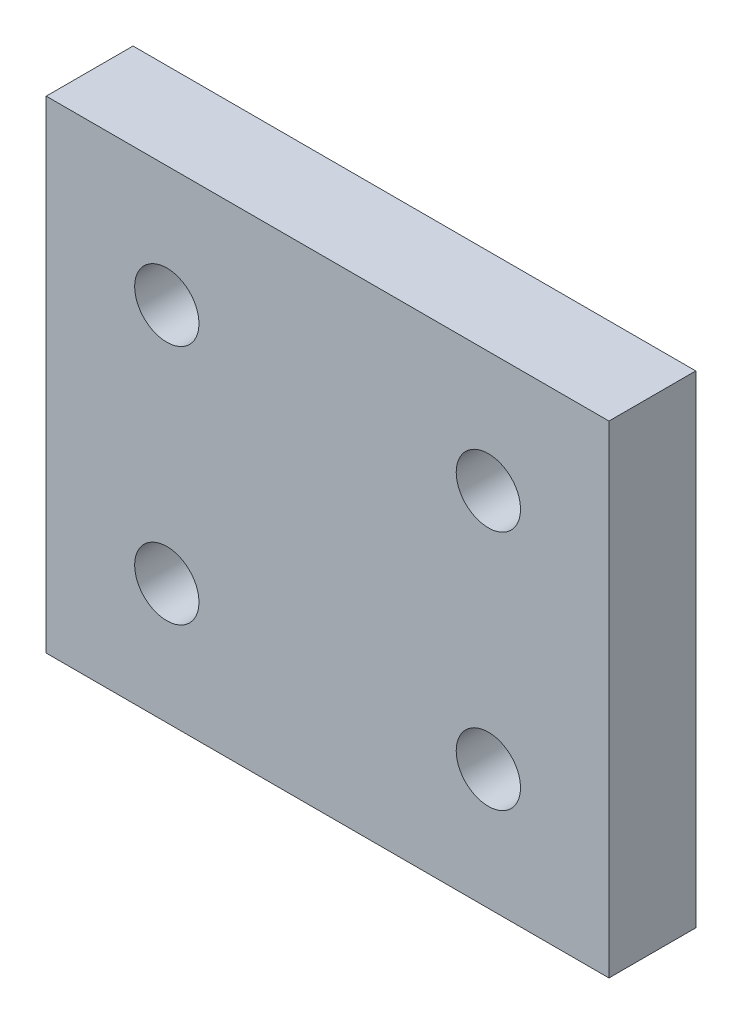
ISO-10303-21;
HEADER;
FILE_DESCRIPTION(('STEP AP214'),'2;1');
FILE_NAME('part.step','',(''),(''),'','','');
FILE_SCHEMA(('AUTOMOTIVE_DESIGN { 1 0 10303 214 1 1 1 1 }'));
ENDSEC;
DATA;
#1=APPLICATION_CONTEXT('core data for automotive mechanical design processes');
#2=APPLICATION_PROTOCOL_DEFINITION('international standard','automotive_design',2000,#1);
#3=PRODUCT_CONTEXT('',#1,'mechanical');
#4=PRODUCT('Part','Part','',(#3));
#5=PRODUCT_RELATED_PRODUCT_CATEGORY('part','',(#4));
#6=PRODUCT_DEFINITION_FORMATION('','',#4);
#7=PRODUCT_DEFINITION_CONTEXT('part definition',#1,'design');
#8=PRODUCT_DEFINITION('design','',#6,#7);
#9=PRODUCT_DEFINITION_SHAPE('','',#8);
#10=(LENGTH_UNIT() NAMED_UNIT(*) SI_UNIT(.MILLI.,.METRE.));
#11=(NAMED_UNIT(*) PLANE_ANGLE_UNIT() SI_UNIT($,.RADIAN.));
#12=(NAMED_UNIT(*) SI_UNIT($,.STERADIAN.) SOLID_ANGLE_UNIT());
#13=UNCERTAINTY_MEASURE_WITH_UNIT(LENGTH_MEASURE(1.E-05),#10,'distance_accuracy_value','');
#14=(GEOMETRIC_REPRESENTATION_CONTEXT(3) GLOBAL_UNCERTAINTY_ASSIGNED_CONTEXT((#13)) GLOBAL_UNIT_ASSIGNED_CONTEXT((#10,
#11,#12)) REPRESENTATION_CONTEXT('',''));
#15=CARTESIAN_POINT('',(0.,0.,0.));
#16=DIRECTION('',(0.,0.,1.));
#17=DIRECTION('',(1.,0.,0.));
#18=AXIS2_PLACEMENT_3D('',#15,#16,#17);
#19=CARTESIAN_POINT('',(0.,0.,5.4));
#20=DIRECTION('',(0.,0.,1.));
#21=DIRECTION('',(1.,0.,0.));
#22=AXIS2_PLACEMENT_3D('',#19,#20,#21);
#23=PLANE('',#22);
#24=CARTESIAN_POINT('',(-10.,19.84,5.4));
#25=DIRECTION('',(0.,0.,1.));
#26=DIRECTION('',(1.,0.,0.));
#27=AXIS2_PLACEMENT_3D('',#24,#25,#26);
#28=CIRCLE('',#27,2.);
#29=CARTESIAN_POINT('',(-12.,19.84,5.4));
#30=VERTEX_POINT('',#29);
#31=EDGE_CURVE('E104',#30,#30,#28,.F.);
#32=ORIENTED_EDGE('',*,*,#31,.T.);
#33=EDGE_LOOP('',(#32));
#34=FACE_BOUND('',#33,.T.);
#35=DIRECTION('',(-1.,0.,0.));
#36=VECTOR('',#35,1.);
#37=CARTESIAN_POINT('',(0.,-2.655,5.4));
#38=LINE('',#37,#36);
#39=CARTESIAN_POINT('',(17.5,-2.655,5.4));
#40=VERTEX_POINT('',#39);
#41=CARTESIAN_POINT('',(-17.5,-2.655,5.4));
#42=VERTEX_POINT('',#41);
#43=EDGE_CURVE('E109',#40,#42,#38,.T.);
#44=ORIENTED_EDGE('',*,*,#43,.F.);
#45=DIRECTION('',(0.,1.,0.));
#46=VECTOR('',#45,1.);
#47=CARTESIAN_POINT('',(17.5,-30.,5.4));
#48=LINE('',#47,#46);
#49=CARTESIAN_POINT('',(17.5,27.345,5.4));
#50=VERTEX_POINT('',#49);
#51=EDGE_CURVE('E11',#40,#50,#48,.T.);
#52=ORIENTED_EDGE('',*,*,#51,.T.);
#53=DIRECTION('',(1.,0.,0.));
#54=VECTOR('',#53,1.);
#55=CARTESIAN_POINT('',(0.,27.345,5.4));
#56=LINE('',#55,#54);
#57=CARTESIAN_POINT('',(-17.5,27.345,5.4));
#58=VERTEX_POINT('',#57);
#59=EDGE_CURVE('E117',#58,#50,#56,.T.);
#60=ORIENTED_EDGE('',*,*,#59,.F.);
#61=DIRECTION('',(0.,-1.,0.));
#62=VECTOR('',#61,1.);
#63=CARTESIAN_POINT('',(-17.5,-30.,5.4));
#64=LINE('',#63,#62);
#65=EDGE_CURVE('E46',#58,#42,#64,.T.);
#66=ORIENTED_EDGE('',*,*,#65,.T.);
#67=EDGE_LOOP('',(#44,#52,#60,#66));
#68=FACE_BOUND('',#67,.T.);
#69=CARTESIAN_POINT('',(10.,4.84,5.4));
#70=DIRECTION('',(0.,0.,1.));
#71=DIRECTION('',(1.,0.,0.));
#72=AXIS2_PLACEMENT_3D('',#69,#70,#71);
#73=CIRCLE('',#72,2.);
#74=CARTESIAN_POINT('',(8.,4.84,5.4));
#75=VERTEX_POINT('',#74);
#76=EDGE_CURVE('E114',#75,#75,#73,.F.);
#77=ORIENTED_EDGE('',*,*,#76,.T.);
#78=EDGE_LOOP('',(#77));
#79=FACE_BOUND('',#78,.T.);
#80=CARTESIAN_POINT('',(-10.,4.84,5.4));
#81=DIRECTION('',(0.,0.,1.));
#82=DIRECTION('',(1.,0.,0.));
#83=AXIS2_PLACEMENT_3D('',#80,#81,#82);
#84=CIRCLE('',#83,2.);
#85=CARTESIAN_POINT('',(-12.,4.84,5.4));
#86=VERTEX_POINT('',#85);
#87=EDGE_CURVE('E111',#86,#86,#84,.F.);
#88=ORIENTED_EDGE('',*,*,#87,.T.);
#89=EDGE_LOOP('',(#88));
#90=FACE_BOUND('',#89,.T.);
#91=CARTESIAN_POINT('',(10.,19.84,5.4));
#92=DIRECTION('',(0.,0.,1.));
#93=DIRECTION('',(1.,0.,0.));
#94=AXIS2_PLACEMENT_3D('',#91,#92,#93);
#95=CIRCLE('',#94,2.);
#96=CARTESIAN_POINT('',(8.,19.84,5.4));
#97=VERTEX_POINT('',#96);
#98=EDGE_CURVE('E100',#97,#97,#95,.F.);
#99=ORIENTED_EDGE('',*,*,#98,.T.);
#100=EDGE_LOOP('',(#99));
#101=FACE_BOUND('',#100,.T.);
#102=ADVANCED_FACE('F37',(#34,#68,#79,#90,#101),#23,.T.);
#103=CARTESIAN_POINT('',(0.,0.,0.));
#104=DIRECTION('',(0.,0.,1.));
#105=DIRECTION('',(1.,0.,0.));
#106=AXIS2_PLACEMENT_3D('',#103,#104,#105);
#107=PLANE('',#106);
#108=DIRECTION('',(0.,1.,0.));
#109=VECTOR('',#108,1.);
#110=CARTESIAN_POINT('',(17.5,-30.,0.));
#111=LINE('',#110,#109);
#112=CARTESIAN_POINT('',(17.5,-2.655,0.));
#113=VERTEX_POINT('',#112);
#114=CARTESIAN_POINT('',(17.5,27.345,0.));
#115=VERTEX_POINT('',#114);
#116=EDGE_CURVE('E41',#113,#115,#111,.T.);
#117=ORIENTED_EDGE('',*,*,#116,.F.);
#118=DIRECTION('',(-1.,0.,0.));
#119=VECTOR('',#118,1.);
#120=CARTESIAN_POINT('',(0.,-2.655,0.));
#121=LINE('',#120,#119);
#122=CARTESIAN_POINT('',(-17.5,-2.655,0.));
#123=VERTEX_POINT('',#122);
#124=EDGE_CURVE('E77',#113,#123,#121,.T.);
#125=ORIENTED_EDGE('',*,*,#124,.T.);
#126=DIRECTION('',(0.,-1.,0.));
#127=VECTOR('',#126,1.);
#128=CARTESIAN_POINT('',(-17.5,-30.,0.));
#129=LINE('',#128,#127);
#130=CARTESIAN_POINT('',(-17.5,27.345,0.));
#131=VERTEX_POINT('',#130);
#132=EDGE_CURVE('E97',#131,#123,#129,.T.);
#133=ORIENTED_EDGE('',*,*,#132,.F.);
#134=DIRECTION('',(-1.,0.,0.));
#135=VECTOR('',#134,1.);
#136=CARTESIAN_POINT('',(0.,27.345,0.));
#137=LINE('',#136,#135);
#138=EDGE_CURVE('E96',#115,#131,#137,.T.);
#139=ORIENTED_EDGE('',*,*,#138,.F.);
#140=EDGE_LOOP('',(#117,#125,#133,#139));
#141=FACE_BOUND('',#140,.T.);
#142=CARTESIAN_POINT('',(10.,4.84,0.));
#143=DIRECTION('',(0.,0.,1.));
#144=DIRECTION('',(1.,0.,0.));
#145=AXIS2_PLACEMENT_3D('',#142,#143,#144);
#146=CIRCLE('',#145,2.);
#147=CARTESIAN_POINT('',(8.,4.84,0.));
#148=VERTEX_POINT('',#147);
#149=EDGE_CURVE('E86',#148,#148,#146,.F.);
#150=ORIENTED_EDGE('',*,*,#149,.F.);
#151=EDGE_LOOP('',(#150));
#152=FACE_BOUND('',#151,.T.);
#153=CARTESIAN_POINT('',(-10.,4.84,0.));
#154=DIRECTION('',(0.,0.,1.));
#155=DIRECTION('',(1.,0.,0.));
#156=AXIS2_PLACEMENT_3D('',#153,#154,#155);
#157=CIRCLE('',#156,2.);
#158=CARTESIAN_POINT('',(-12.,4.84,0.));
#159=VERTEX_POINT('',#158);
#160=EDGE_CURVE('E127',#159,#159,#157,.F.);
#161=ORIENTED_EDGE('',*,*,#160,.F.);
#162=EDGE_LOOP('',(#161));
#163=FACE_BOUND('',#162,.T.);
#164=CARTESIAN_POINT('',(-10.,19.84,0.));
#165=DIRECTION('',(0.,0.,1.));
#166=DIRECTION('',(1.,0.,0.));
#167=AXIS2_PLACEMENT_3D('',#164,#165,#166);
#168=CIRCLE('',#167,2.);
#169=CARTESIAN_POINT('',(-12.,19.84,0.));
#170=VERTEX_POINT('',#169);
#171=EDGE_CURVE('E123',#170,#170,#168,.F.);
#172=ORIENTED_EDGE('',*,*,#171,.F.);
#173=EDGE_LOOP('',(#172));
#174=FACE_BOUND('',#173,.T.);
#175=CARTESIAN_POINT('',(10.,19.84,0.));
#176=DIRECTION('',(0.,0.,1.));
#177=DIRECTION('',(1.,0.,0.));
#178=AXIS2_PLACEMENT_3D('',#175,#176,#177);
#179=CIRCLE('',#178,2.);
#180=CARTESIAN_POINT('',(8.,19.84,0.));
#181=VERTEX_POINT('',#180);
#182=EDGE_CURVE('E124',#181,#181,#179,.F.);
#183=ORIENTED_EDGE('',*,*,#182,.F.);
#184=EDGE_LOOP('',(#183));
#185=FACE_BOUND('',#184,.T.);
#186=ADVANCED_FACE('F94',(#141,#152,#163,#174,#185),#107,.F.);
#187=CARTESIAN_POINT('',(-17.5,-30.,5.4));
#188=DIRECTION('',(1.,0.,0.));
#189=DIRECTION('',(0.,0.,-1.));
#190=AXIS2_PLACEMENT_3D('',#187,#188,#189);
#191=PLANE('',#190);
#192=ORIENTED_EDGE('',*,*,#132,.T.);
#193=DIRECTION('',(0.,0.,-1.));
#194=VECTOR('',#193,1.);
#195=CARTESIAN_POINT('',(-17.5,-2.655,5.400012));
#196=LINE('',#195,#194);
#197=EDGE_CURVE('E62',#42,#123,#196,.T.);
#198=ORIENTED_EDGE('',*,*,#197,.F.);
#199=ORIENTED_EDGE('',*,*,#65,.F.);
#200=DIRECTION('',(0.,0.,1.));
#201=VECTOR('',#200,1.);
#202=CARTESIAN_POINT('',(-17.5,27.345,-0.00100000000000013));
#203=LINE('',#202,#201);
#204=EDGE_CURVE('E92',#131,#58,#203,.T.);
#205=ORIENTED_EDGE('',*,*,#204,.F.);
#206=EDGE_LOOP('',(#192,#198,#199,#205));
#207=FACE_BOUND('',#206,.T.);
#208=ADVANCED_FACE('F39',(#207),#191,.F.);
#209=CARTESIAN_POINT('',(17.5,-30.,5.4));
#210=DIRECTION('',(-1.,0.,0.));
#211=DIRECTION('',(0.,0.,1.));
#212=AXIS2_PLACEMENT_3D('',#209,#210,#211);
#213=PLANE('',#212);
#214=ORIENTED_EDGE('',*,*,#51,.F.);
#215=DIRECTION('',(0.,0.,-1.));
#216=VECTOR('',#215,1.);
#217=CARTESIAN_POINT('',(17.5,-2.655,5.400012));
#218=LINE('',#217,#216);
#219=EDGE_CURVE('E80',#40,#113,#218,.T.);
#220=ORIENTED_EDGE('',*,*,#219,.T.);
#221=ORIENTED_EDGE('',*,*,#116,.T.);
#222=DIRECTION('',(0.,0.,1.));
#223=VECTOR('',#222,1.);
#224=CARTESIAN_POINT('',(17.5,27.345,-0.00100000000000013));
#225=LINE('',#224,#223);
#226=EDGE_CURVE('E54',#115,#50,#225,.T.);
#227=ORIENTED_EDGE('',*,*,#226,.T.);
#228=EDGE_LOOP('',(#214,#220,#221,#227));
#229=FACE_BOUND('',#228,.T.);
#230=ADVANCED_FACE('F91',(#229),#213,.F.);
#231=CARTESIAN_POINT('',(0.,27.345,-0.00100000000000013));
#232=DIRECTION('',(0.,-1.,0.));
#233=DIRECTION('',(0.,0.,-1.));
#234=AXIS2_PLACEMENT_3D('',#231,#232,#233);
#235=PLANE('',#234);
#236=ORIENTED_EDGE('',*,*,#59,.T.);
#237=ORIENTED_EDGE('',*,*,#226,.F.);
#238=ORIENTED_EDGE('',*,*,#138,.T.);
#239=ORIENTED_EDGE('',*,*,#204,.T.);
#240=EDGE_LOOP('',(#236,#237,#238,#239));
#241=FACE_BOUND('',#240,.T.);
#242=ADVANCED_FACE('F163',(#241),#235,.F.);
#243=CARTESIAN_POINT('',(10.,4.84,5.400012));
#244=DIRECTION('',(0.,0.,-1.));
#245=DIRECTION('',(-1.,0.,0.));
#246=AXIS2_PLACEMENT_3D('',#243,#244,#245);
#247=CYLINDRICAL_SURFACE('',#246,2.);
#248=CARTESIAN_POINT('',(8.,4.84,5.4));
#249=CARTESIAN_POINT('',(8.,4.84,5.34375));
#250=CARTESIAN_POINT('',(8.,4.84,5.2875));
#251=CARTESIAN_POINT('',(8.,4.84,5.175));
#252=CARTESIAN_POINT('',(8.,4.84,5.11875));
#253=CARTESIAN_POINT('',(8.,4.84,5.00625));
#254=CARTESIAN_POINT('',(8.,4.84,4.95));
#255=CARTESIAN_POINT('',(8.,4.84,4.8375));
#256=CARTESIAN_POINT('',(8.,4.84,4.78125));
#257=CARTESIAN_POINT('',(8.,4.84,4.66875));
#258=CARTESIAN_POINT('',(8.,4.84,4.6125));
#259=CARTESIAN_POINT('',(8.,4.84,4.5));
#260=CARTESIAN_POINT('',(8.,4.84,4.44375));
#261=CARTESIAN_POINT('',(8.,4.84,4.33125));
#262=CARTESIAN_POINT('',(8.,4.84,4.275));
#263=CARTESIAN_POINT('',(8.,4.84,4.1625));
#264=CARTESIAN_POINT('',(8.,4.84,4.10625));
#265=CARTESIAN_POINT('',(8.,4.84,3.99375));
#266=CARTESIAN_POINT('',(8.,4.84,3.9375));
#267=CARTESIAN_POINT('',(8.,4.84,3.825));
#268=CARTESIAN_POINT('',(8.,4.84,3.76875));
#269=CARTESIAN_POINT('',(8.,4.84,3.65625));
#270=CARTESIAN_POINT('',(8.,4.84,3.6));
#271=CARTESIAN_POINT('',(8.,4.84,3.4875));
#272=CARTESIAN_POINT('',(8.,4.84,3.43125));
#273=CARTESIAN_POINT('',(8.,4.84,3.31875));
#274=CARTESIAN_POINT('',(8.,4.84,3.2625));
#275=CARTESIAN_POINT('',(8.,4.84,3.15));
#276=CARTESIAN_POINT('',(8.,4.84,3.09375));
#277=CARTESIAN_POINT('',(8.,4.84,2.98125));
#278=CARTESIAN_POINT('',(8.,4.84,2.925));
#279=CARTESIAN_POINT('',(8.,4.84,2.8125));
#280=CARTESIAN_POINT('',(8.,4.84,2.75625));
#281=CARTESIAN_POINT('',(8.,4.84,2.64375));
#282=CARTESIAN_POINT('',(8.,4.84,2.5875));
#283=CARTESIAN_POINT('',(8.,4.84,2.475));
#284=CARTESIAN_POINT('',(8.,4.84,2.41875));
#285=CARTESIAN_POINT('',(8.,4.84,2.30625));
#286=CARTESIAN_POINT('',(8.,4.84,2.25));
#287=CARTESIAN_POINT('',(8.,4.84,2.1375));
#288=CARTESIAN_POINT('',(8.,4.84,2.08125));
#289=CARTESIAN_POINT('',(8.,4.84,1.96875));
#290=CARTESIAN_POINT('',(8.,4.84,1.9125));
#291=CARTESIAN_POINT('',(8.,4.84,1.8));
#292=CARTESIAN_POINT('',(8.,4.84,1.74375));
#293=CARTESIAN_POINT('',(8.,4.84,1.63125));
#294=CARTESIAN_POINT('',(8.,4.84,1.575));
#295=CARTESIAN_POINT('',(8.,4.84,1.4625));
#296=CARTESIAN_POINT('',(8.,4.84,1.40625));
#297=CARTESIAN_POINT('',(8.,4.84,1.29375));
#298=CARTESIAN_POINT('',(8.,4.84,1.2375));
#299=CARTESIAN_POINT('',(8.,4.84,1.125));
#300=CARTESIAN_POINT('',(8.,4.84,1.06875));
#301=CARTESIAN_POINT('',(8.,4.84,0.95625));
#302=CARTESIAN_POINT('',(8.,4.84,0.9));
#303=CARTESIAN_POINT('',(8.,4.84,0.7875));
#304=CARTESIAN_POINT('',(8.,4.84,0.73125));
#305=CARTESIAN_POINT('',(8.,4.84,0.61875));
#306=CARTESIAN_POINT('',(8.,4.84,0.5625));
#307=CARTESIAN_POINT('',(8.,4.84,0.45));
#308=CARTESIAN_POINT('',(8.,4.84,0.39375));
#309=CARTESIAN_POINT('',(8.,4.84,0.28125));
#310=CARTESIAN_POINT('',(8.,4.84,0.225));
#311=CARTESIAN_POINT('',(8.,4.84,0.1125));
#312=CARTESIAN_POINT('',(8.,4.84,0.0562499999999998));
#313=CARTESIAN_POINT('',(8.,4.84,0.));
#314=B_SPLINE_CURVE_WITH_KNOTS('',3,(#248,#249,#250,#251,#252,#253,#254,#255,#256,#257,#258,
#259,#260,#261,#262,#263,#264,#265,#266,#267,#268,#269,#270,#271,#272,#273,#274,#275,#276,#277,
#278,#279,#280,#281,#282,#283,#284,#285,#286,#287,#288,#289,#290,#291,#292,#293,#294,#295,#296,
#297,#298,#299,#300,#301,#302,#303,#304,#305,#306,#307,#308,#309,#310,#311,#312,#313),
.UNSPECIFIED.,.F.,.F.,(4,2,2,2,2,2,2,2,2,2,2,2,2,2,2,2,2,2,2,2,2,2,2,2,2,2,2,2,2,2,2,2,4),(0.,
0.16875,0.337499999999999,0.50625,0.674999999999999,0.84375,1.0125,1.18125,1.35,1.51875,1.6875,
1.85625,2.025,2.19375,2.3625,2.53125,2.7,2.86875,3.0375,3.20625,3.375,3.54375,3.7125,3.88125,
4.05,4.21875,4.3875,4.55625,4.725,4.89375,5.0625,5.23125,5.4),.UNSPECIFIED.);
#315=EDGE_CURVE('BSEAM169',#75,#148,#314,.T.);
#316=ORIENTED_EDGE('',*,*,#76,.F.);
#317=ORIENTED_EDGE('',*,*,#149,.T.);
#318=ORIENTED_EDGE('',*,*,#315,.T.);
#319=ORIENTED_EDGE('',*,*,#315,.F.);
#320=EDGE_LOOP('',(#316,#318,#317,#319));
#321=FACE_BOUND('',#320,.T.);
#322=ADVANCED_FACE('F169',(#321),#247,.F.);
#323=CARTESIAN_POINT('',(-10.,4.84,5.400012));
#324=DIRECTION('',(0.,0.,-1.));
#325=DIRECTION('',(-1.,0.,0.));
#326=AXIS2_PLACEMENT_3D('',#323,#324,#325);
#327=CYLINDRICAL_SURFACE('',#326,2.);
#328=CARTESIAN_POINT('',(-12.,4.84,5.4));
#329=CARTESIAN_POINT('',(-12.,4.84,5.34375));
#330=CARTESIAN_POINT('',(-12.,4.84,5.2875));
#331=CARTESIAN_POINT('',(-12.,4.84,5.175));
#332=CARTESIAN_POINT('',(-12.,4.84,5.11875));
#333=CARTESIAN_POINT('',(-12.,4.84,5.00625));
#334=CARTESIAN_POINT('',(-12.,4.84,4.95));
#335=CARTESIAN_POINT('',(-12.,4.84,4.8375));
#336=CARTESIAN_POINT('',(-12.,4.84,4.78125));
#337=CARTESIAN_POINT('',(-12.,4.84,4.66875));
#338=CARTESIAN_POINT('',(-12.,4.84,4.6125));
#339=CARTESIAN_POINT('',(-12.,4.84,4.5));
#340=CARTESIAN_POINT('',(-12.,4.84,4.44375));
#341=CARTESIAN_POINT('',(-12.,4.84,4.33125));
#342=CARTESIAN_POINT('',(-12.,4.84,4.275));
#343=CARTESIAN_POINT('',(-12.,4.84,4.1625));
#344=CARTESIAN_POINT('',(-12.,4.84,4.10625));
#345=CARTESIAN_POINT('',(-12.,4.84,3.99375));
#346=CARTESIAN_POINT('',(-12.,4.84,3.9375));
#347=CARTESIAN_POINT('',(-12.,4.84,3.825));
#348=CARTESIAN_POINT('',(-12.,4.84,3.76875));
#349=CARTESIAN_POINT('',(-12.,4.84,3.65625));
#350=CARTESIAN_POINT('',(-12.,4.84,3.6));
#351=CARTESIAN_POINT('',(-12.,4.84,3.4875));
#352=CARTESIAN_POINT('',(-12.,4.84,3.43125));
#353=CARTESIAN_POINT('',(-12.,4.84,3.31875));
#354=CARTESIAN_POINT('',(-12.,4.84,3.2625));
#355=CARTESIAN_POINT('',(-12.,4.84,3.15));
#356=CARTESIAN_POINT('',(-12.,4.84,3.09375));
#357=CARTESIAN_POINT('',(-12.,4.84,2.98125));
#358=CARTESIAN_POINT('',(-12.,4.84,2.925));
#359=CARTESIAN_POINT('',(-12.,4.84,2.8125));
#360=CARTESIAN_POINT('',(-12.,4.84,2.75625));
#361=CARTESIAN_POINT('',(-12.,4.84,2.64375));
#362=CARTESIAN_POINT('',(-12.,4.84,2.5875));
#363=CARTESIAN_POINT('',(-12.,4.84,2.475));
#364=CARTESIAN_POINT('',(-12.,4.84,2.41875));
#365=CARTESIAN_POINT('',(-12.,4.84,2.30625));
#366=CARTESIAN_POINT('',(-12.,4.84,2.25));
#367=CARTESIAN_POINT('',(-12.,4.84,2.1375));
#368=CARTESIAN_POINT('',(-12.,4.84,2.08125));
#369=CARTESIAN_POINT('',(-12.,4.84,1.96875));
#370=CARTESIAN_POINT('',(-12.,4.84,1.9125));
#371=CARTESIAN_POINT('',(-12.,4.84,1.8));
#372=CARTESIAN_POINT('',(-12.,4.84,1.74375));
#373=CARTESIAN_POINT('',(-12.,4.84,1.63125));
#374=CARTESIAN_POINT('',(-12.,4.84,1.575));
#375=CARTESIAN_POINT('',(-12.,4.84,1.4625));
#376=CARTESIAN_POINT('',(-12.,4.84,1.40625));
#377=CARTESIAN_POINT('',(-12.,4.84,1.29375));
#378=CARTESIAN_POINT('',(-12.,4.84,1.2375));
#379=CARTESIAN_POINT('',(-12.,4.84,1.125));
#380=CARTESIAN_POINT('',(-12.,4.84,1.06875));
#381=CARTESIAN_POINT('',(-12.,4.84,0.95625));
#382=CARTESIAN_POINT('',(-12.,4.84,0.9));
#383=CARTESIAN_POINT('',(-12.,4.84,0.7875));
#384=CARTESIAN_POINT('',(-12.,4.84,0.73125));
#385=CARTESIAN_POINT('',(-12.,4.84,0.61875));
#386=CARTESIAN_POINT('',(-12.,4.84,0.5625));
#387=CARTESIAN_POINT('',(-12.,4.84,0.45));
#388=CARTESIAN_POINT('',(-12.,4.84,0.39375));
#389=CARTESIAN_POINT('',(-12.,4.84,0.28125));
#390=CARTESIAN_POINT('',(-12.,4.84,0.225));
#391=CARTESIAN_POINT('',(-12.,4.84,0.1125));
#392=CARTESIAN_POINT('',(-12.,4.84,0.0562499999999998));
#393=CARTESIAN_POINT('',(-12.,4.84,0.));
#394=B_SPLINE_CURVE_WITH_KNOTS('',3,(#328,#329,#330,#331,#332,#333,#334,#335,#336,#337,#338,
#339,#340,#341,#342,#343,#344,#345,#346,#347,#348,#349,#350,#351,#352,#353,#354,#355,#356,#357,
#358,#359,#360,#361,#362,#363,#364,#365,#366,#367,#368,#369,#370,#371,#372,#373,#374,#375,#376,
#377,#378,#379,#380,#381,#382,#383,#384,#385,#386,#387,#388,#389,#390,#391,#392,#393),
.UNSPECIFIED.,.F.,.F.,(4,2,2,2,2,2,2,2,2,2,2,2,2,2,2,2,2,2,2,2,2,2,2,2,2,2,2,2,2,2,2,2,4),(0.,
0.16875,0.337499999999999,0.50625,0.674999999999999,0.84375,1.0125,1.18125,1.35,1.51875,1.6875,
1.85625,2.025,2.19375,2.3625,2.53125,2.7,2.86875,3.0375,3.20625,3.375,3.54375,3.7125,3.88125,
4.05,4.21875,4.3875,4.55625,4.725,4.89375,5.0625,5.23125,5.4),.UNSPECIFIED.);
#395=EDGE_CURVE('BSEAM135',#86,#159,#394,.T.);
#396=ORIENTED_EDGE('',*,*,#87,.F.);
#397=ORIENTED_EDGE('',*,*,#160,.T.);
#398=ORIENTED_EDGE('',*,*,#395,.T.);
#399=ORIENTED_EDGE('',*,*,#395,.F.);
#400=EDGE_LOOP('',(#396,#398,#397,#399));
#401=FACE_BOUND('',#400,.T.);
#402=ADVANCED_FACE('F135',(#401),#327,.F.);
#403=CARTESIAN_POINT('',(0.,-2.655,5.400012));
#404=DIRECTION('',(0.,1.,0.));
#405=DIRECTION('',(-1.,0.,0.));
#406=AXIS2_PLACEMENT_3D('',#403,#404,#405);
#407=PLANE('',#406);
#408=ORIENTED_EDGE('',*,*,#43,.T.);
#409=ORIENTED_EDGE('',*,*,#197,.T.);
#410=ORIENTED_EDGE('',*,*,#124,.F.);
#411=ORIENTED_EDGE('',*,*,#219,.F.);
#412=EDGE_LOOP('',(#408,#409,#410,#411));
#413=FACE_BOUND('',#412,.T.);
#414=ADVANCED_FACE('F79',(#413),#407,.F.);
#415=CARTESIAN_POINT('',(-10.,19.84,5.400012));
#416=DIRECTION('',(0.,0.,-1.));
#417=DIRECTION('',(-1.,0.,0.));
#418=AXIS2_PLACEMENT_3D('',#415,#416,#417);
#419=CYLINDRICAL_SURFACE('',#418,2.);
#420=CARTESIAN_POINT('',(-12.,19.84,5.4));
#421=CARTESIAN_POINT('',(-12.,19.84,5.34375));
#422=CARTESIAN_POINT('',(-12.,19.84,5.2875));
#423=CARTESIAN_POINT('',(-12.,19.84,5.175));
#424=CARTESIAN_POINT('',(-12.,19.84,5.11875));
#425=CARTESIAN_POINT('',(-12.,19.84,5.00625));
#426=CARTESIAN_POINT('',(-12.,19.84,4.95));
#427=CARTESIAN_POINT('',(-12.,19.84,4.8375));
#428=CARTESIAN_POINT('',(-12.,19.84,4.78125));
#429=CARTESIAN_POINT('',(-12.,19.84,4.66875));
#430=CARTESIAN_POINT('',(-12.,19.84,4.6125));
#431=CARTESIAN_POINT('',(-12.,19.84,4.5));
#432=CARTESIAN_POINT('',(-12.,19.84,4.44375));
#433=CARTESIAN_POINT('',(-12.,19.84,4.33125));
#434=CARTESIAN_POINT('',(-12.,19.84,4.275));
#435=CARTESIAN_POINT('',(-12.,19.84,4.1625));
#436=CARTESIAN_POINT('',(-12.,19.84,4.10625));
#437=CARTESIAN_POINT('',(-12.,19.84,3.99375));
#438=CARTESIAN_POINT('',(-12.,19.84,3.9375));
#439=CARTESIAN_POINT('',(-12.,19.84,3.825));
#440=CARTESIAN_POINT('',(-12.,19.84,3.76875));
#441=CARTESIAN_POINT('',(-12.,19.84,3.65625));
#442=CARTESIAN_POINT('',(-12.,19.84,3.6));
#443=CARTESIAN_POINT('',(-12.,19.84,3.4875));
#444=CARTESIAN_POINT('',(-12.,19.84,3.43125));
#445=CARTESIAN_POINT('',(-12.,19.84,3.31875));
#446=CARTESIAN_POINT('',(-12.,19.84,3.2625));
#447=CARTESIAN_POINT('',(-12.,19.84,3.15));
#448=CARTESIAN_POINT('',(-12.,19.84,3.09375));
#449=CARTESIAN_POINT('',(-12.,19.84,2.98125));
#450=CARTESIAN_POINT('',(-12.,19.84,2.925));
#451=CARTESIAN_POINT('',(-12.,19.84,2.8125));
#452=CARTESIAN_POINT('',(-12.,19.84,2.75625));
#453=CARTESIAN_POINT('',(-12.,19.84,2.64375));
#454=CARTESIAN_POINT('',(-12.,19.84,2.5875));
#455=CARTESIAN_POINT('',(-12.,19.84,2.475));
#456=CARTESIAN_POINT('',(-12.,19.84,2.41875));
#457=CARTESIAN_POINT('',(-12.,19.84,2.30625));
#458=CARTESIAN_POINT('',(-12.,19.84,2.25));
#459=CARTESIAN_POINT('',(-12.,19.84,2.1375));
#460=CARTESIAN_POINT('',(-12.,19.84,2.08125));
#461=CARTESIAN_POINT('',(-12.,19.84,1.96875));
#462=CARTESIAN_POINT('',(-12.,19.84,1.9125));
#463=CARTESIAN_POINT('',(-12.,19.84,1.8));
#464=CARTESIAN_POINT('',(-12.,19.84,1.74375));
#465=CARTESIAN_POINT('',(-12.,19.84,1.63125));
#466=CARTESIAN_POINT('',(-12.,19.84,1.575));
#467=CARTESIAN_POINT('',(-12.,19.84,1.4625));
#468=CARTESIAN_POINT('',(-12.,19.84,1.40625));
#469=CARTESIAN_POINT('',(-12.,19.84,1.29375));
#470=CARTESIAN_POINT('',(-12.,19.84,1.2375));
#471=CARTESIAN_POINT('',(-12.,19.84,1.125));
#472=CARTESIAN_POINT('',(-12.,19.84,1.06875));
#473=CARTESIAN_POINT('',(-12.,19.84,0.95625));
#474=CARTESIAN_POINT('',(-12.,19.84,0.9));
#475=CARTESIAN_POINT('',(-12.,19.84,0.7875));
#476=CARTESIAN_POINT('',(-12.,19.84,0.73125));
#477=CARTESIAN_POINT('',(-12.,19.84,0.61875));
#478=CARTESIAN_POINT('',(-12.,19.84,0.5625));
#479=CARTESIAN_POINT('',(-12.,19.84,0.45));
#480=CARTESIAN_POINT('',(-12.,19.84,0.39375));
#481=CARTESIAN_POINT('',(-12.,19.84,0.28125));
#482=CARTESIAN_POINT('',(-12.,19.84,0.225));
#483=CARTESIAN_POINT('',(-12.,19.84,0.1125));
#484=CARTESIAN_POINT('',(-12.,19.84,0.0562499999999998));
#485=CARTESIAN_POINT('',(-12.,19.84,0.));
#486=B_SPLINE_CURVE_WITH_KNOTS('',3,(#420,#421,#422,#423,#424,#425,#426,#427,#428,#429,#430,
#431,#432,#433,#434,#435,#436,#437,#438,#439,#440,#441,#442,#443,#444,#445,#446,#447,#448,#449,
#450,#451,#452,#453,#454,#455,#456,#457,#458,#459,#460,#461,#462,#463,#464,#465,#466,#467,#468,
#469,#470,#471,#472,#473,#474,#475,#476,#477,#478,#479,#480,#481,#482,#483,#484,#485),
.UNSPECIFIED.,.F.,.F.,(4,2,2,2,2,2,2,2,2,2,2,2,2,2,2,2,2,2,2,2,2,2,2,2,2,2,2,2,2,2,2,2,4),(0.,
0.16875,0.337499999999999,0.50625,0.674999999999999,0.84375,1.0125,1.18125,1.35,1.51875,1.6875,
1.85625,2.025,2.19375,2.3625,2.53125,2.7,2.86875,3.0375,3.20625,3.375,3.54375,3.7125,3.88125,
4.05,4.21875,4.3875,4.55625,4.725,4.89375,5.0625,5.23125,5.4),.UNSPECIFIED.);
#487=EDGE_CURVE('BSEAM146',#30,#170,#486,.T.);
#488=ORIENTED_EDGE('',*,*,#31,.F.);
#489=ORIENTED_EDGE('',*,*,#171,.T.);
#490=ORIENTED_EDGE('',*,*,#487,.T.);
#491=ORIENTED_EDGE('',*,*,#487,.F.);
#492=EDGE_LOOP('',(#488,#490,#489,#491));
#493=FACE_BOUND('',#492,.T.);
#494=ADVANCED_FACE('F146',(#493),#419,.F.);
#495=CARTESIAN_POINT('',(10.,19.84,5.400012));
#496=DIRECTION('',(0.,0.,-1.));
#497=DIRECTION('',(-1.,0.,0.));
#498=AXIS2_PLACEMENT_3D('',#495,#496,#497);
#499=CYLINDRICAL_SURFACE('',#498,2.);
#500=CARTESIAN_POINT('',(8.,19.84,5.4));
#501=CARTESIAN_POINT('',(8.,19.84,5.34375));
#502=CARTESIAN_POINT('',(8.,19.84,5.2875));
#503=CARTESIAN_POINT('',(8.,19.84,5.175));
#504=CARTESIAN_POINT('',(8.,19.84,5.11875));
#505=CARTESIAN_POINT('',(8.,19.84,5.00625));
#506=CARTESIAN_POINT('',(8.,19.84,4.95));
#507=CARTESIAN_POINT('',(8.,19.84,4.8375));
#508=CARTESIAN_POINT('',(8.,19.84,4.78125));
#509=CARTESIAN_POINT('',(8.,19.84,4.66875));
#510=CARTESIAN_POINT('',(8.,19.84,4.6125));
#511=CARTESIAN_POINT('',(8.,19.84,4.5));
#512=CARTESIAN_POINT('',(8.,19.84,4.44375));
#513=CARTESIAN_POINT('',(8.,19.84,4.33125));
#514=CARTESIAN_POINT('',(8.,19.84,4.275));
#515=CARTESIAN_POINT('',(8.,19.84,4.1625));
#516=CARTESIAN_POINT('',(8.,19.84,4.10625));
#517=CARTESIAN_POINT('',(8.,19.84,3.99375));
#518=CARTESIAN_POINT('',(8.,19.84,3.9375));
#519=CARTESIAN_POINT('',(8.,19.84,3.825));
#520=CARTESIAN_POINT('',(8.,19.84,3.76875));
#521=CARTESIAN_POINT('',(8.,19.84,3.65625));
#522=CARTESIAN_POINT('',(8.,19.84,3.6));
#523=CARTESIAN_POINT('',(8.,19.84,3.4875));
#524=CARTESIAN_POINT('',(8.,19.84,3.43125));
#525=CARTESIAN_POINT('',(8.,19.84,3.31875));
#526=CARTESIAN_POINT('',(8.,19.84,3.2625));
#527=CARTESIAN_POINT('',(8.,19.84,3.15));
#528=CARTESIAN_POINT('',(8.,19.84,3.09375));
#529=CARTESIAN_POINT('',(8.,19.84,2.98125));
#530=CARTESIAN_POINT('',(8.,19.84,2.925));
#531=CARTESIAN_POINT('',(8.,19.84,2.8125));
#532=CARTESIAN_POINT('',(8.,19.84,2.75625));
#533=CARTESIAN_POINT('',(8.,19.84,2.64375));
#534=CARTESIAN_POINT('',(8.,19.84,2.5875));
#535=CARTESIAN_POINT('',(8.,19.84,2.475));
#536=CARTESIAN_POINT('',(8.,19.84,2.41875));
#537=CARTESIAN_POINT('',(8.,19.84,2.30625));
#538=CARTESIAN_POINT('',(8.,19.84,2.25));
#539=CARTESIAN_POINT('',(8.,19.84,2.1375));
#540=CARTESIAN_POINT('',(8.,19.84,2.08125));
#541=CARTESIAN_POINT('',(8.,19.84,1.96875));
#542=CARTESIAN_POINT('',(8.,19.84,1.9125));
#543=CARTESIAN_POINT('',(8.,19.84,1.8));
#544=CARTESIAN_POINT('',(8.,19.84,1.74375));
#545=CARTESIAN_POINT('',(8.,19.84,1.63125));
#546=CARTESIAN_POINT('',(8.,19.84,1.575));
#547=CARTESIAN_POINT('',(8.,19.84,1.4625));
#548=CARTESIAN_POINT('',(8.,19.84,1.40625));
#549=CARTESIAN_POINT('',(8.,19.84,1.29375));
#550=CARTESIAN_POINT('',(8.,19.84,1.2375));
#551=CARTESIAN_POINT('',(8.,19.84,1.125));
#552=CARTESIAN_POINT('',(8.,19.84,1.06875));
#553=CARTESIAN_POINT('',(8.,19.84,0.95625));
#554=CARTESIAN_POINT('',(8.,19.84,0.9));
#555=CARTESIAN_POINT('',(8.,19.84,0.7875));
#556=CARTESIAN_POINT('',(8.,19.84,0.73125));
#557=CARTESIAN_POINT('',(8.,19.84,0.61875));
#558=CARTESIAN_POINT('',(8.,19.84,0.5625));
#559=CARTESIAN_POINT('',(8.,19.84,0.45));
#560=CARTESIAN_POINT('',(8.,19.84,0.39375));
#561=CARTESIAN_POINT('',(8.,19.84,0.28125));
#562=CARTESIAN_POINT('',(8.,19.84,0.225));
#563=CARTESIAN_POINT('',(8.,19.84,0.1125));
#564=CARTESIAN_POINT('',(8.,19.84,0.0562499999999998));
#565=CARTESIAN_POINT('',(8.,19.84,0.));
#566=B_SPLINE_CURVE_WITH_KNOTS('',3,(#500,#501,#502,#503,#504,#505,#506,#507,#508,#509,#510,
#511,#512,#513,#514,#515,#516,#517,#518,#519,#520,#521,#522,#523,#524,#525,#526,#527,#528,#529,
#530,#531,#532,#533,#534,#535,#536,#537,#538,#539,#540,#541,#542,#543,#544,#545,#546,#547,#548,
#549,#550,#551,#552,#553,#554,#555,#556,#557,#558,#559,#560,#561,#562,#563,#564,#565),
.UNSPECIFIED.,.F.,.F.,(4,2,2,2,2,2,2,2,2,2,2,2,2,2,2,2,2,2,2,2,2,2,2,2,2,2,2,2,2,2,2,2,4),(0.,
0.16875,0.337499999999999,0.50625,0.674999999999999,0.84375,1.0125,1.18125,1.35,1.51875,1.6875,
1.85625,2.025,2.19375,2.3625,2.53125,2.7,2.86875,3.0375,3.20625,3.375,3.54375,3.7125,3.88125,
4.05,4.21875,4.3875,4.55625,4.725,4.89375,5.0625,5.23125,5.4),.UNSPECIFIED.);
#567=EDGE_CURVE('BSEAM144',#97,#181,#566,.T.);
#568=ORIENTED_EDGE('',*,*,#98,.F.);
#569=ORIENTED_EDGE('',*,*,#182,.T.);
#570=ORIENTED_EDGE('',*,*,#567,.T.);
#571=ORIENTED_EDGE('',*,*,#567,.F.);
#572=EDGE_LOOP('',(#568,#570,#569,#571));
#573=FACE_BOUND('',#572,.T.);
#574=ADVANCED_FACE('F144',(#573),#499,.F.);
#575=CLOSED_SHELL('',(#102,#186,#208,#230,#242,#322,#402,#414,#494,#574));
#576=MANIFOLD_SOLID_BREP('B2',#575);
#577=ADVANCED_BREP_SHAPE_REPRESENTATION('',(#18,#576),#14);
#578=SHAPE_DEFINITION_REPRESENTATION(#9,#577);
ENDSEC;
END-ISO-10303-21;
